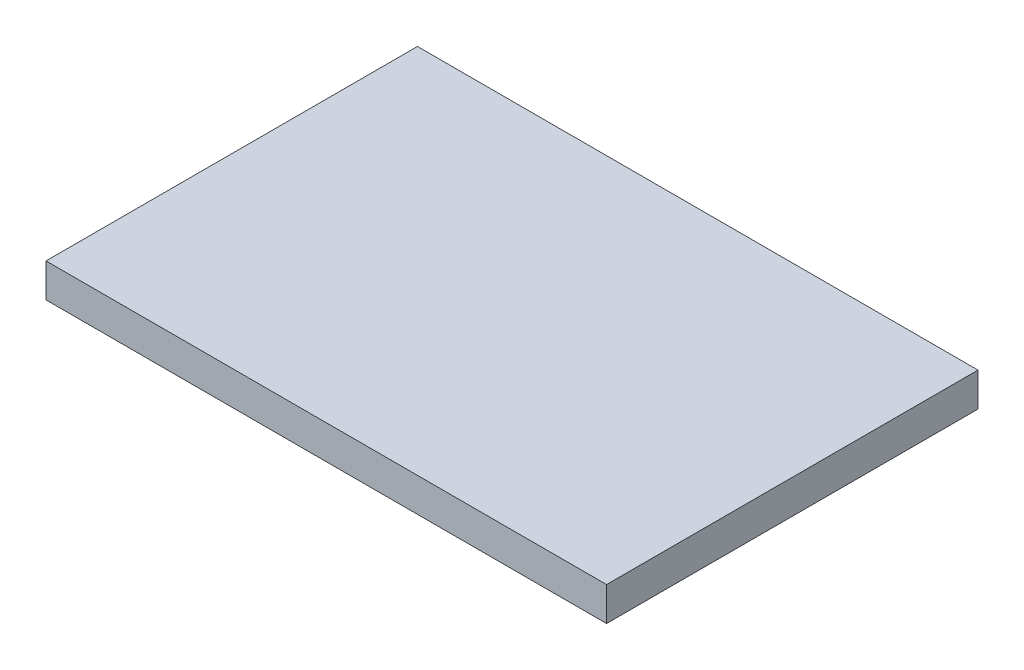
ISO-10303-21;
HEADER;
FILE_DESCRIPTION(('STEP AP214'),'2;1');
FILE_NAME('part.step','',(''),(''),'','','');
FILE_SCHEMA(('AUTOMOTIVE_DESIGN { 1 0 10303 214 1 1 1 1 }'));
ENDSEC;
DATA;
#1=APPLICATION_CONTEXT('core data for automotive mechanical design processes');
#2=APPLICATION_PROTOCOL_DEFINITION('international standard','automotive_design',2000,#1);
#3=PRODUCT_CONTEXT('',#1,'mechanical');
#4=PRODUCT('Part','Part','',(#3));
#5=PRODUCT_RELATED_PRODUCT_CATEGORY('part','',(#4));
#6=PRODUCT_DEFINITION_FORMATION('','',#4);
#7=PRODUCT_DEFINITION_CONTEXT('part definition',#1,'design');
#8=PRODUCT_DEFINITION('design','',#6,#7);
#9=PRODUCT_DEFINITION_SHAPE('','',#8);
#10=(LENGTH_UNIT() NAMED_UNIT(*) SI_UNIT(.MILLI.,.METRE.));
#11=(NAMED_UNIT(*) PLANE_ANGLE_UNIT() SI_UNIT($,.RADIAN.));
#12=(NAMED_UNIT(*) SI_UNIT($,.STERADIAN.) SOLID_ANGLE_UNIT());
#13=UNCERTAINTY_MEASURE_WITH_UNIT(LENGTH_MEASURE(1.E-05),#10,'distance_accuracy_value','');
#14=(GEOMETRIC_REPRESENTATION_CONTEXT(3) GLOBAL_UNCERTAINTY_ASSIGNED_CONTEXT((#13)) GLOBAL_UNIT_ASSIGNED_CONTEXT((#10,
#11,#12)) REPRESENTATION_CONTEXT('',''));
#15=CARTESIAN_POINT('',(0.,0.,0.));
#16=DIRECTION('',(0.,0.,1.));
#17=DIRECTION('',(1.,0.,0.));
#18=AXIS2_PLACEMENT_3D('',#15,#16,#17);
#19=CARTESIAN_POINT('',(41.5000000000001,5.,27.5000000000001));
#20=DIRECTION('',(-1.,0.,0.));
#21=DIRECTION('',(0.,0.,1.));
#22=AXIS2_PLACEMENT_3D('',#19,#20,#21);
#23=PLANE('',#22);
#24=DIRECTION('',(0.,0.,-1.));
#25=VECTOR('',#24,1.);
#26=CARTESIAN_POINT('',(41.5000000000001,0.,27.5000000000001));
#27=LINE('',#26,#25);
#28=CARTESIAN_POINT('',(41.5000000000001,0.,27.5000000000001));
#29=VERTEX_POINT('',#28);
#30=CARTESIAN_POINT('',(41.5000000000001,0.,-27.4999999999999));
#31=VERTEX_POINT('',#30);
#32=EDGE_CURVE('E115',#29,#31,#27,.T.);
#33=ORIENTED_EDGE('',*,*,#32,.T.);
#34=DIRECTION('',(0.,-1.,0.));
#35=VECTOR('',#34,1.);
#36=CARTESIAN_POINT('',(41.5000000000001,5.,-27.4999999999999));
#37=LINE('',#36,#35);
#38=CARTESIAN_POINT('',(41.5000000000001,5.,-27.4999999999999));
#39=VERTEX_POINT('',#38);
#40=EDGE_CURVE('E11',#39,#31,#37,.T.);
#41=ORIENTED_EDGE('',*,*,#40,.F.);
#42=DIRECTION('',(0.,0.,-1.));
#43=VECTOR('',#42,1.);
#44=CARTESIAN_POINT('',(41.5000000000001,5.,27.5000000000001));
#45=LINE('',#44,#43);
#46=CARTESIAN_POINT('',(41.5000000000001,5.,27.5000000000001));
#47=VERTEX_POINT('',#46);
#48=EDGE_CURVE('E99',#47,#39,#45,.T.);
#49=ORIENTED_EDGE('',*,*,#48,.F.);
#50=DIRECTION('',(0.,-1.,0.));
#51=VECTOR('',#50,1.);
#52=CARTESIAN_POINT('',(41.5000000000001,5.,27.5000000000001));
#53=LINE('',#52,#51);
#54=EDGE_CURVE('E111',#47,#29,#53,.T.);
#55=ORIENTED_EDGE('',*,*,#54,.T.);
#56=EDGE_LOOP('',(#33,#41,#49,#55));
#57=FACE_BOUND('',#56,.T.);
#58=ADVANCED_FACE('F47',(#57),#23,.F.);
#59=CARTESIAN_POINT('',(-41.5000000000001,5.,-27.4999999999999));
#60=DIRECTION('',(0.,0.,1.));
#61=DIRECTION('',(1.,0.,0.));
#62=AXIS2_PLACEMENT_3D('',#59,#60,#61);
#63=PLANE('',#62);
#64=DIRECTION('',(-1.,0.,0.));
#65=VECTOR('',#64,1.);
#66=CARTESIAN_POINT('',(-41.5000000000001,0.,-27.4999999999999));
#67=LINE('',#66,#65);
#68=CARTESIAN_POINT('',(-41.5000000000001,0.,-27.4999999999999));
#69=VERTEX_POINT('',#68);
#70=EDGE_CURVE('E104',#31,#69,#67,.T.);
#71=ORIENTED_EDGE('',*,*,#70,.T.);
#72=DIRECTION('',(0.,-1.,0.));
#73=VECTOR('',#72,1.);
#74=CARTESIAN_POINT('',(-41.5000000000001,5.,-27.4999999999999));
#75=LINE('',#74,#73);
#76=CARTESIAN_POINT('',(-41.5000000000001,5.,-27.4999999999999));
#77=VERTEX_POINT('',#76);
#78=EDGE_CURVE('E56',#77,#69,#75,.T.);
#79=ORIENTED_EDGE('',*,*,#78,.F.);
#80=DIRECTION('',(-1.,0.,0.));
#81=VECTOR('',#80,1.);
#82=CARTESIAN_POINT('',(-41.5000000000001,5.,-27.4999999999999));
#83=LINE('',#82,#81);
#84=EDGE_CURVE('E94',#39,#77,#83,.T.);
#85=ORIENTED_EDGE('',*,*,#84,.F.);
#86=ORIENTED_EDGE('',*,*,#40,.T.);
#87=EDGE_LOOP('',(#71,#79,#85,#86));
#88=FACE_BOUND('',#87,.T.);
#89=ADVANCED_FACE('F103',(#88),#63,.F.);
#90=CARTESIAN_POINT('',(-41.5000000000001,5.,27.5000000000001));
#91=DIRECTION('',(1.,0.,0.));
#92=DIRECTION('',(0.,0.,-1.));
#93=AXIS2_PLACEMENT_3D('',#90,#91,#92);
#94=PLANE('',#93);
#95=DIRECTION('',(0.,0.,1.));
#96=VECTOR('',#95,1.);
#97=CARTESIAN_POINT('',(-41.5000000000001,0.,27.5000000000001));
#98=LINE('',#97,#96);
#99=CARTESIAN_POINT('',(-41.5000000000001,0.,27.5000000000001));
#100=VERTEX_POINT('',#99);
#101=EDGE_CURVE('E81',#69,#100,#98,.T.);
#102=ORIENTED_EDGE('',*,*,#101,.T.);
#103=DIRECTION('',(0.,-1.,0.));
#104=VECTOR('',#103,1.);
#105=CARTESIAN_POINT('',(-41.5000000000001,5.,27.5000000000001));
#106=LINE('',#105,#104);
#107=CARTESIAN_POINT('',(-41.5000000000001,5.,27.5000000000001));
#108=VERTEX_POINT('',#107);
#109=EDGE_CURVE('E106',#108,#100,#106,.T.);
#110=ORIENTED_EDGE('',*,*,#109,.F.);
#111=DIRECTION('',(0.,0.,1.));
#112=VECTOR('',#111,1.);
#113=CARTESIAN_POINT('',(-41.5000000000001,5.,27.5000000000001));
#114=LINE('',#113,#112);
#115=EDGE_CURVE('E97',#77,#108,#114,.T.);
#116=ORIENTED_EDGE('',*,*,#115,.F.);
#117=ORIENTED_EDGE('',*,*,#78,.T.);
#118=EDGE_LOOP('',(#102,#110,#116,#117));
#119=FACE_BOUND('',#118,.T.);
#120=ADVANCED_FACE('F107',(#119),#94,.F.);
#121=CARTESIAN_POINT('',(-41.5000000000001,5.,27.5000000000001));
#122=DIRECTION('',(0.,0.,-1.));
#123=DIRECTION('',(-1.,0.,0.));
#124=AXIS2_PLACEMENT_3D('',#121,#122,#123);
#125=PLANE('',#124);
#126=DIRECTION('',(1.,0.,0.));
#127=VECTOR('',#126,1.);
#128=CARTESIAN_POINT('',(-41.5000000000001,0.,27.5000000000001));
#129=LINE('',#128,#127);
#130=EDGE_CURVE('E87',#100,#29,#129,.T.);
#131=ORIENTED_EDGE('',*,*,#130,.T.);
#132=ORIENTED_EDGE('',*,*,#54,.F.);
#133=DIRECTION('',(1.,0.,0.));
#134=VECTOR('',#133,1.);
#135=CARTESIAN_POINT('',(-41.5000000000001,5.,27.5000000000001));
#136=LINE('',#135,#134);
#137=EDGE_CURVE('E64',#108,#47,#136,.T.);
#138=ORIENTED_EDGE('',*,*,#137,.F.);
#139=ORIENTED_EDGE('',*,*,#109,.T.);
#140=EDGE_LOOP('',(#131,#132,#138,#139));
#141=FACE_BOUND('',#140,.T.);
#142=ADVANCED_FACE('F128',(#141),#125,.F.);
#143=CARTESIAN_POINT('',(0.,5.,0.));
#144=DIRECTION('',(0.,-1.,0.));
#145=DIRECTION('',(0.,0.,-1.));
#146=AXIS2_PLACEMENT_3D('',#143,#144,#145);
#147=PLANE('',#146);
#148=ORIENTED_EDGE('',*,*,#48,.T.);
#149=ORIENTED_EDGE('',*,*,#84,.T.);
#150=ORIENTED_EDGE('',*,*,#115,.T.);
#151=ORIENTED_EDGE('',*,*,#137,.T.);
#152=EDGE_LOOP('',(#148,#149,#150,#151));
#153=FACE_BOUND('',#152,.T.);
#154=ADVANCED_FACE('F95',(#153),#147,.F.);
#155=CARTESIAN_POINT('',(0.,0.,0.));
#156=DIRECTION('',(0.,-1.,0.));
#157=DIRECTION('',(0.,0.,-1.));
#158=AXIS2_PLACEMENT_3D('',#155,#156,#157);
#159=PLANE('',#158);
#160=ORIENTED_EDGE('',*,*,#32,.F.);
#161=ORIENTED_EDGE('',*,*,#130,.F.);
#162=ORIENTED_EDGE('',*,*,#101,.F.);
#163=ORIENTED_EDGE('',*,*,#70,.F.);
#164=EDGE_LOOP('',(#160,#161,#162,#163));
#165=FACE_BOUND('',#164,.T.);
#166=ADVANCED_FACE('F131',(#165),#159,.T.);
#167=CLOSED_SHELL('',(#58,#89,#120,#142,#154,#166));
#168=MANIFOLD_SOLID_BREP('B2',#167);
#169=ADVANCED_BREP_SHAPE_REPRESENTATION('',(#18,#168),#14);
#170=SHAPE_DEFINITION_REPRESENTATION(#9,#169);
ENDSEC;
END-ISO-10303-21;
